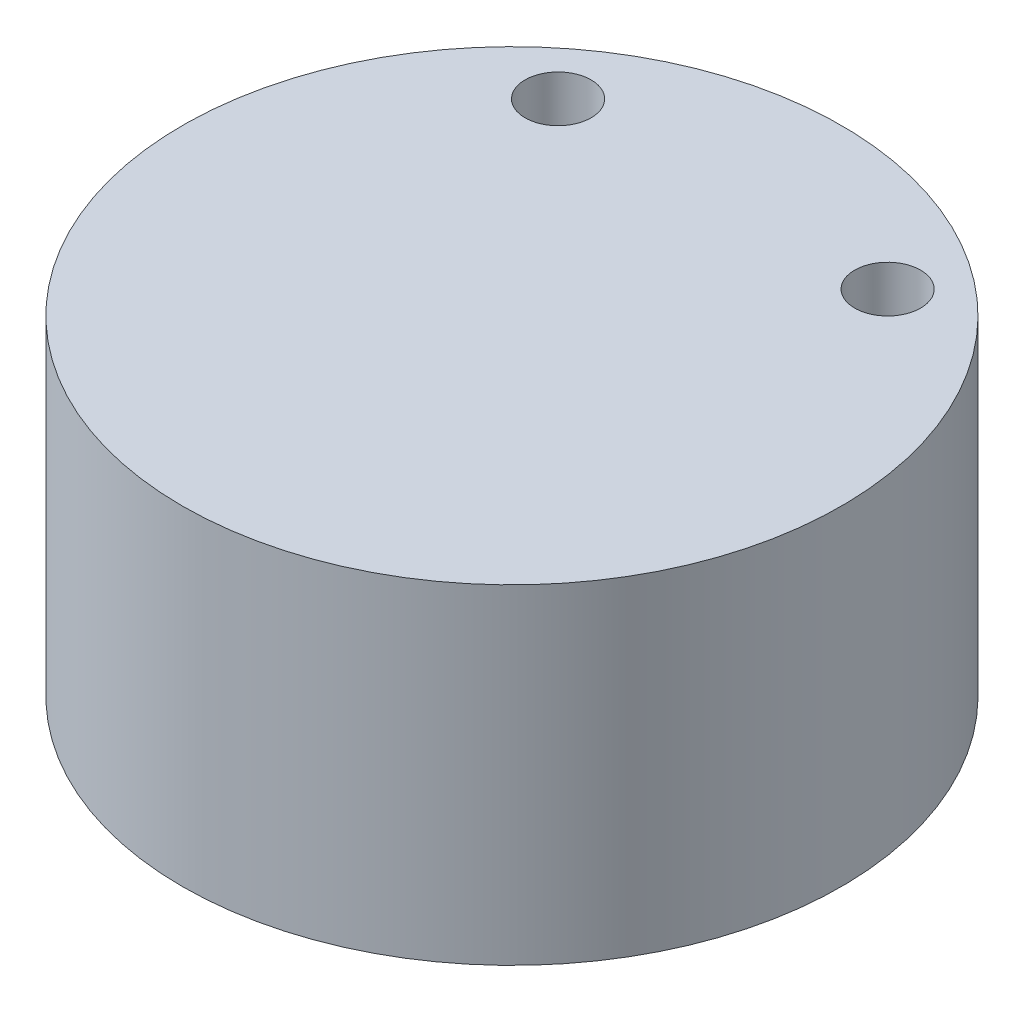
ISO-10303-21;
HEADER;
FILE_DESCRIPTION(('STEP AP214'),'2;1');
FILE_NAME('part.step','',(''),(''),'','','');
FILE_SCHEMA(('AUTOMOTIVE_DESIGN { 1 0 10303 214 1 1 1 1 }'));
ENDSEC;
DATA;
#1=APPLICATION_CONTEXT('core data for automotive mechanical design processes');
#2=APPLICATION_PROTOCOL_DEFINITION('international standard','automotive_design',2000,#1);
#3=PRODUCT_CONTEXT('',#1,'mechanical');
#4=PRODUCT('Part','Part','',(#3));
#5=PRODUCT_RELATED_PRODUCT_CATEGORY('part','',(#4));
#6=PRODUCT_DEFINITION_FORMATION('','',#4);
#7=PRODUCT_DEFINITION_CONTEXT('part definition',#1,'design');
#8=PRODUCT_DEFINITION('design','',#6,#7);
#9=PRODUCT_DEFINITION_SHAPE('','',#8);
#10=(LENGTH_UNIT() NAMED_UNIT(*) SI_UNIT(.MILLI.,.METRE.));
#11=(NAMED_UNIT(*) PLANE_ANGLE_UNIT() SI_UNIT($,.RADIAN.));
#12=(NAMED_UNIT(*) SI_UNIT($,.STERADIAN.) SOLID_ANGLE_UNIT());
#13=UNCERTAINTY_MEASURE_WITH_UNIT(LENGTH_MEASURE(1.E-05),#10,'distance_accuracy_value','');
#14=(GEOMETRIC_REPRESENTATION_CONTEXT(3) GLOBAL_UNCERTAINTY_ASSIGNED_CONTEXT((#13)) GLOBAL_UNIT_ASSIGNED_CONTEXT((#10,
#11,#12)) REPRESENTATION_CONTEXT('',''));
#15=CARTESIAN_POINT('',(0.,0.,0.));
#16=DIRECTION('',(0.,0.,1.));
#17=DIRECTION('',(1.,0.,0.));
#18=AXIS2_PLACEMENT_3D('',#15,#16,#17);
#19=CARTESIAN_POINT('',(0.,3.96875,0.));
#20=DIRECTION('',(0.,1.,0.));
#21=DIRECTION('',(0.,0.,1.));
#22=AXIS2_PLACEMENT_3D('',#19,#20,#21);
#23=PLANE('',#22);
#24=CARTESIAN_POINT('',(0.,3.96875,0.));
#25=DIRECTION('',(0.,1.,0.));
#26=DIRECTION('',(0.,0.,1.));
#27=AXIS2_PLACEMENT_3D('',#24,#25,#26);
#28=CIRCLE('',#27,3.96875);
#29=CARTESIAN_POINT('',(0.,3.96875,3.96875));
#30=VERTEX_POINT('',#29);
#31=EDGE_CURVE('E10',#30,#30,#28,.T.);
#32=ORIENTED_EDGE('',*,*,#31,.T.);
#33=EDGE_LOOP('',(#32));
#34=FACE_BOUND('',#33,.T.);
#35=CARTESIAN_POINT('',(-1.984375,3.96875,-2.54));
#36=DIRECTION('',(0.,-1.,0.));
#37=DIRECTION('',(0.,0.,-1.));
#38=AXIS2_PLACEMENT_3D('',#35,#36,#37);
#39=CIRCLE('',#38,0.396875);
#40=CARTESIAN_POINT('',(-1.984375,3.96875,-2.936875));
#41=VERTEX_POINT('',#40);
#42=EDGE_CURVE('E50',#41,#41,#39,.T.);
#43=ORIENTED_EDGE('',*,*,#42,.T.);
#44=EDGE_LOOP('',(#43));
#45=FACE_BOUND('',#44,.T.);
#46=CARTESIAN_POINT('',(1.984375,3.96875,-2.54));
#47=DIRECTION('',(0.,-1.,0.));
#48=DIRECTION('',(0.,0.,-1.));
#49=AXIS2_PLACEMENT_3D('',#46,#47,#48);
#50=CIRCLE('',#49,0.396875);
#51=CARTESIAN_POINT('',(1.984375,3.96875,-2.936875));
#52=VERTEX_POINT('',#51);
#53=EDGE_CURVE('E48',#52,#52,#50,.F.);
#54=ORIENTED_EDGE('',*,*,#53,.F.);
#55=EDGE_LOOP('',(#54));
#56=FACE_BOUND('',#55,.T.);
#57=ADVANCED_FACE('F37',(#34,#45,#56),#23,.T.);
#58=CARTESIAN_POINT('',(0.,0.,0.));
#59=DIRECTION('',(0.,1.,0.));
#60=DIRECTION('',(0.,0.,1.));
#61=AXIS2_PLACEMENT_3D('',#58,#59,#60);
#62=PLANE('',#61);
#63=CARTESIAN_POINT('',(-1.984375,0.,-2.54));
#64=DIRECTION('',(0.,-1.,0.));
#65=DIRECTION('',(0.,0.,-1.));
#66=AXIS2_PLACEMENT_3D('',#63,#64,#65);
#67=CIRCLE('',#66,0.396875);
#68=CARTESIAN_POINT('',(-1.984375,0.,-2.936875));
#69=VERTEX_POINT('',#68);
#70=EDGE_CURVE('E53',#69,#69,#67,.T.);
#71=ORIENTED_EDGE('',*,*,#70,.F.);
#72=EDGE_LOOP('',(#71));
#73=FACE_BOUND('',#72,.T.);
#74=CARTESIAN_POINT('',(0.,0.,0.));
#75=DIRECTION('',(0.,1.,0.));
#76=DIRECTION('',(0.,0.,1.));
#77=AXIS2_PLACEMENT_3D('',#74,#75,#76);
#78=CIRCLE('',#77,3.96875);
#79=CARTESIAN_POINT('',(0.,0.,3.96875));
#80=VERTEX_POINT('',#79);
#81=EDGE_CURVE('E41',#80,#80,#78,.T.);
#82=ORIENTED_EDGE('',*,*,#81,.F.);
#83=EDGE_LOOP('',(#82));
#84=FACE_BOUND('',#83,.T.);
#85=CARTESIAN_POINT('',(1.984375,0.,-2.54));
#86=DIRECTION('',(0.,-1.,0.));
#87=DIRECTION('',(0.,0.,-1.));
#88=AXIS2_PLACEMENT_3D('',#85,#86,#87);
#89=CIRCLE('',#88,0.396875);
#90=CARTESIAN_POINT('',(1.984375,0.,-2.936875));
#91=VERTEX_POINT('',#90);
#92=EDGE_CURVE('E56',#91,#91,#89,.F.);
#93=ORIENTED_EDGE('',*,*,#92,.T.);
#94=EDGE_LOOP('',(#93));
#95=FACE_BOUND('',#94,.T.);
#96=ADVANCED_FACE('F66',(#73,#84,#95),#62,.F.);
#97=CARTESIAN_POINT('',(0.,3.96875,0.));
#98=DIRECTION('',(0.,-1.,0.));
#99=DIRECTION('',(0.,0.,-1.));
#100=AXIS2_PLACEMENT_3D('',#97,#98,#99);
#101=CYLINDRICAL_SURFACE('',#100,3.96875);
#102=ORIENTED_EDGE('',*,*,#31,.F.);
#103=EDGE_LOOP('',(#102));
#104=FACE_BOUND('',#103,.T.);
#105=ORIENTED_EDGE('',*,*,#81,.T.);
#106=EDGE_LOOP('',(#105));
#107=FACE_BOUND('',#106,.T.);
#108=ADVANCED_FACE('F39',(#104,#107),#101,.T.);
#109=CARTESIAN_POINT('',(-1.984375,3.96875,-2.54));
#110=DIRECTION('',(0.,-1.,0.));
#111=DIRECTION('',(0.,0.,-1.));
#112=AXIS2_PLACEMENT_3D('',#109,#110,#111);
#113=CYLINDRICAL_SURFACE('',#112,0.396875);
#114=ORIENTED_EDGE('',*,*,#42,.F.);
#115=EDGE_LOOP('',(#114));
#116=FACE_BOUND('',#115,.T.);
#117=ORIENTED_EDGE('',*,*,#70,.T.);
#118=EDGE_LOOP('',(#117));
#119=FACE_BOUND('',#118,.T.);
#120=ADVANCED_FACE('F75',(#116,#119),#113,.F.);
#121=CARTESIAN_POINT('',(1.984375,3.96875,-2.54));
#122=DIRECTION('',(0.,-1.,0.));
#123=DIRECTION('',(0.,0.,-1.));
#124=AXIS2_PLACEMENT_3D('',#121,#122,#123);
#125=CYLINDRICAL_SURFACE('',#124,0.396875);
#126=ORIENTED_EDGE('',*,*,#53,.T.);
#127=EDGE_LOOP('',(#126));
#128=FACE_BOUND('',#127,.T.);
#129=ORIENTED_EDGE('',*,*,#92,.F.);
#130=EDGE_LOOP('',(#129));
#131=FACE_BOUND('',#130,.T.);
#132=ADVANCED_FACE('F62',(#128,#131),#125,.F.);
#133=CLOSED_SHELL('',(#57,#96,#108,#120,#132));
#134=MANIFOLD_SOLID_BREP('B2',#133);
#135=ADVANCED_BREP_SHAPE_REPRESENTATION('',(#18,#134),#14);
#136=SHAPE_DEFINITION_REPRESENTATION(#9,#135);
ENDSEC;
END-ISO-10303-21;
